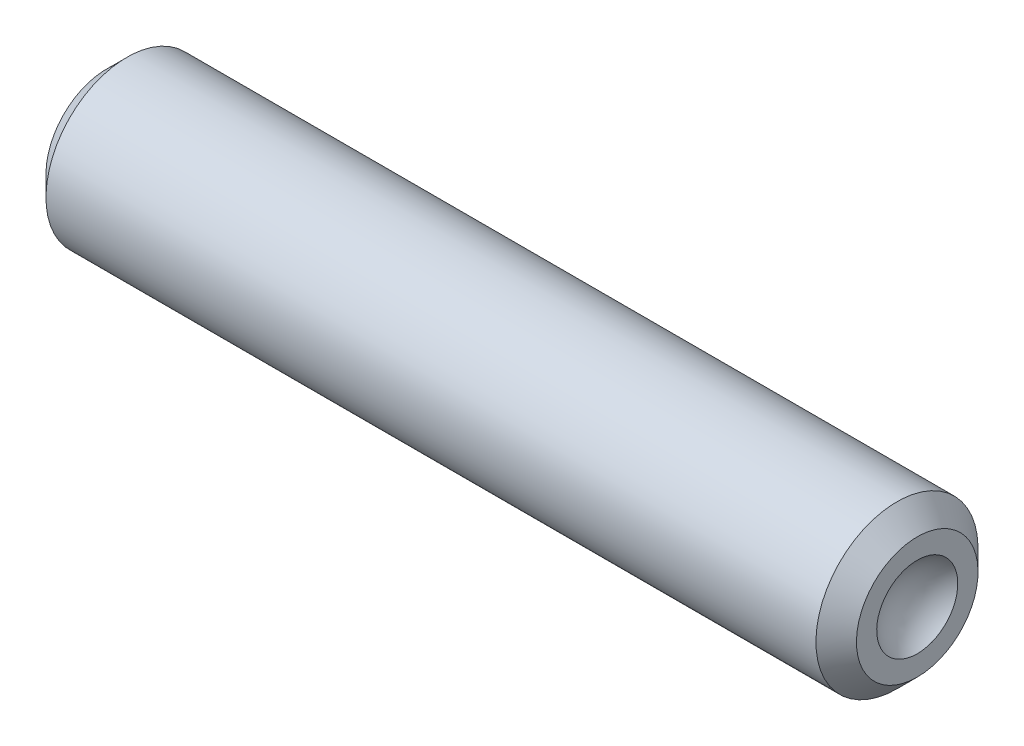
ISO-10303-21;
HEADER;
FILE_DESCRIPTION(('STEP AP214'),'2;1');
FILE_NAME('part.step','',(''),(''),'','','');
FILE_SCHEMA(('AUTOMOTIVE_DESIGN { 1 0 10303 214 1 1 1 1 }'));
ENDSEC;
DATA;
#1=APPLICATION_CONTEXT('core data for automotive mechanical design processes');
#2=APPLICATION_PROTOCOL_DEFINITION('international standard','automotive_design',2000,#1);
#3=PRODUCT_CONTEXT('',#1,'mechanical');
#4=PRODUCT('Part','Part','',(#3));
#5=PRODUCT_RELATED_PRODUCT_CATEGORY('part','',(#4));
#6=PRODUCT_DEFINITION_FORMATION('','',#4);
#7=PRODUCT_DEFINITION_CONTEXT('part definition',#1,'design');
#8=PRODUCT_DEFINITION('design','',#6,#7);
#9=PRODUCT_DEFINITION_SHAPE('','',#8);
#10=(LENGTH_UNIT() NAMED_UNIT(*) SI_UNIT(.MILLI.,.METRE.));
#11=(NAMED_UNIT(*) PLANE_ANGLE_UNIT() SI_UNIT($,.RADIAN.));
#12=(NAMED_UNIT(*) SI_UNIT($,.STERADIAN.) SOLID_ANGLE_UNIT());
#13=UNCERTAINTY_MEASURE_WITH_UNIT(LENGTH_MEASURE(1.E-05),#10,'distance_accuracy_value','');
#14=(GEOMETRIC_REPRESENTATION_CONTEXT(3) GLOBAL_UNCERTAINTY_ASSIGNED_CONTEXT((#13)) GLOBAL_UNIT_ASSIGNED_CONTEXT((#10,
#11,#12)) REPRESENTATION_CONTEXT('',''));
#15=CARTESIAN_POINT('',(0.,0.,0.));
#16=DIRECTION('',(0.,0.,1.));
#17=DIRECTION('',(1.,0.,0.));
#18=AXIS2_PLACEMENT_3D('',#15,#16,#17);
#19=CARTESIAN_POINT('',(0.,0.,0.));
#20=DIRECTION('',(1.,0.,0.));
#21=DIRECTION('',(0.,1.,0.));
#22=AXIS2_PLACEMENT_3D('',#19,#20,#21);
#23=PLANE('',#22);
#24=DIRECTION('',(0.,-0.5,-0.866025403784439));
#25=VECTOR('',#24,1.);
#26=CARTESIAN_POINT('',(0.,1.15470053837925,0.));
#27=LINE('',#26,#25);
#28=CARTESIAN_POINT('',(0.,1.15470053837925,0.));
#29=VERTEX_POINT('',#28);
#30=CARTESIAN_POINT('',(0.,0.577350269189626,-1.));
#31=VERTEX_POINT('',#30);
#32=EDGE_CURVE('E107',#29,#31,#27,.T.);
#33=ORIENTED_EDGE('',*,*,#32,.F.);
#34=DIRECTION('',(0.,0.5,-0.866025403784438));
#35=VECTOR('',#34,1.);
#36=CARTESIAN_POINT('',(0.,0.577350269189626,1.));
#37=LINE('',#36,#35);
#38=CARTESIAN_POINT('',(0.,0.577350269189626,1.));
#39=VERTEX_POINT('',#38);
#40=EDGE_CURVE('E49',#39,#29,#37,.T.);
#41=ORIENTED_EDGE('',*,*,#40,.F.);
#42=DIRECTION('',(0.,1.,0.));
#43=VECTOR('',#42,1.);
#44=CARTESIAN_POINT('',(0.,-0.577350269189626,1.));
#45=LINE('',#44,#43);
#46=CARTESIAN_POINT('',(0.,-0.577350269189626,1.));
#47=VERTEX_POINT('',#46);
#48=EDGE_CURVE('E122',#47,#39,#45,.T.);
#49=ORIENTED_EDGE('',*,*,#48,.F.);
#50=DIRECTION('',(0.,0.5,0.866025403784439));
#51=VECTOR('',#50,1.);
#52=CARTESIAN_POINT('',(0.,-1.15470053837925,0.));
#53=LINE('',#52,#51);
#54=CARTESIAN_POINT('',(0.,-1.15470053837925,0.));
#55=VERTEX_POINT('',#54);
#56=EDGE_CURVE('E116',#55,#47,#53,.T.);
#57=ORIENTED_EDGE('',*,*,#56,.F.);
#58=DIRECTION('',(0.,-0.5,0.866025403784438));
#59=VECTOR('',#58,1.);
#60=CARTESIAN_POINT('',(0.,-0.577350269189625,-1.));
#61=LINE('',#60,#59);
#62=CARTESIAN_POINT('',(0.,-0.577350269189625,-1.));
#63=VERTEX_POINT('',#62);
#64=EDGE_CURVE('E114',#63,#55,#61,.T.);
#65=ORIENTED_EDGE('',*,*,#64,.F.);
#66=DIRECTION('',(0.,-1.,0.));
#67=VECTOR('',#66,1.);
#68=CARTESIAN_POINT('',(0.,0.577350269189626,-1.));
#69=LINE('',#68,#67);
#70=EDGE_CURVE('E100',#31,#63,#69,.T.);
#71=ORIENTED_EDGE('',*,*,#70,.F.);
#72=EDGE_LOOP('',(#33,#41,#49,#57,#65,#71));
#73=FACE_BOUND('',#72,.T.);
#74=CARTESIAN_POINT('',(0.,0.,0.));
#75=DIRECTION('',(-1.,0.,0.));
#76=DIRECTION('',(0.,-1.,0.));
#77=AXIS2_PLACEMENT_3D('',#74,#75,#76);
#78=CIRCLE('',#77,1.5);
#79=CARTESIAN_POINT('',(0.,-1.5,0.));
#80=VERTEX_POINT('',#79);
#81=EDGE_CURVE('E12',#80,#80,#78,.T.);
#82=ORIENTED_EDGE('',*,*,#81,.T.);
#83=EDGE_LOOP('',(#82));
#84=FACE_BOUND('',#83,.T.);
#85=ADVANCED_FACE('F35',(#73,#84),#23,.F.);
#86=CARTESIAN_POINT('',(0.500000000000001,0.,0.));
#87=DIRECTION('',(1.,0.,0.));
#88=DIRECTION('',(0.,1.,0.));
#89=AXIS2_PLACEMENT_3D('',#86,#87,#88);
#90=CONICAL_SURFACE('',#89,2.,0.785398163397447);
#91=ORIENTED_EDGE('',*,*,#81,.F.);
#92=EDGE_LOOP('',(#91));
#93=FACE_BOUND('',#92,.T.);
#94=CARTESIAN_POINT('',(0.500000000000001,0.,0.));
#95=DIRECTION('',(-1.,0.,0.));
#96=DIRECTION('',(0.,-1.,0.));
#97=AXIS2_PLACEMENT_3D('',#94,#95,#96);
#98=CIRCLE('',#97,2.);
#99=CARTESIAN_POINT('',(0.500000000000001,-2.,0.));
#100=VERTEX_POINT('',#99);
#101=EDGE_CURVE('E42',#100,#100,#98,.T.);
#102=ORIENTED_EDGE('',*,*,#101,.T.);
#103=EDGE_LOOP('',(#102));
#104=FACE_BOUND('',#103,.T.);
#105=ADVANCED_FACE('F145',(#93,#104),#90,.T.);
#106=CARTESIAN_POINT('',(0.,0.,0.));
#107=DIRECTION('',(-1.,0.,0.));
#108=DIRECTION('',(0.,-1.,0.));
#109=AXIS2_PLACEMENT_3D('',#106,#107,#108);
#110=CYLINDRICAL_SURFACE('',#109,2.);
#111=ORIENTED_EDGE('',*,*,#101,.F.);
#112=EDGE_LOOP('',(#111));
#113=FACE_BOUND('',#112,.T.);
#114=CARTESIAN_POINT('',(19.5,0.,0.));
#115=DIRECTION('',(-1.,0.,0.));
#116=DIRECTION('',(0.,-1.,0.));
#117=AXIS2_PLACEMENT_3D('',#114,#115,#116);
#118=CIRCLE('',#117,2.);
#119=CARTESIAN_POINT('',(19.5,-2.,0.));
#120=VERTEX_POINT('',#119);
#121=EDGE_CURVE('E140',#120,#120,#118,.T.);
#122=ORIENTED_EDGE('',*,*,#121,.T.);
#123=EDGE_LOOP('',(#122));
#124=FACE_BOUND('',#123,.T.);
#125=ADVANCED_FACE('F147',(#113,#124),#110,.T.);
#126=CARTESIAN_POINT('',(20.,0.,0.));
#127=DIRECTION('',(-1.,0.,0.));
#128=DIRECTION('',(0.,-1.,0.));
#129=AXIS2_PLACEMENT_3D('',#126,#127,#128);
#130=CONICAL_SURFACE('',#129,1.5,0.785398163397449);
#131=ORIENTED_EDGE('',*,*,#121,.F.);
#132=EDGE_LOOP('',(#131));
#133=FACE_BOUND('',#132,.T.);
#134=CARTESIAN_POINT('',(20.,0.,0.));
#135=DIRECTION('',(-1.,0.,0.));
#136=DIRECTION('',(0.,-1.,0.));
#137=AXIS2_PLACEMENT_3D('',#134,#135,#136);
#138=CIRCLE('',#137,1.5);
#139=CARTESIAN_POINT('',(20.,-1.5,0.));
#140=VERTEX_POINT('',#139);
#141=EDGE_CURVE('E137',#140,#140,#138,.T.);
#142=ORIENTED_EDGE('',*,*,#141,.T.);
#143=EDGE_LOOP('',(#142));
#144=FACE_BOUND('',#143,.T.);
#145=ADVANCED_FACE('F150',(#133,#144),#130,.T.);
#146=CARTESIAN_POINT('',(20.,1.5,0.));
#147=DIRECTION('',(-1.,0.,0.));
#148=DIRECTION('',(0.,-1.,0.));
#149=AXIS2_PLACEMENT_3D('',#146,#147,#148);
#150=PLANE('',#149);
#151=ORIENTED_EDGE('',*,*,#141,.F.);
#152=EDGE_LOOP('',(#151));
#153=FACE_BOUND('',#152,.T.);
#154=CARTESIAN_POINT('',(20.,0.,0.));
#155=DIRECTION('',(-1.,0.,0.));
#156=DIRECTION('',(0.,-1.,0.));
#157=AXIS2_PLACEMENT_3D('',#154,#155,#156);
#158=CIRCLE('',#157,1.);
#159=CARTESIAN_POINT('',(20.,-1.,0.));
#160=VERTEX_POINT('',#159);
#161=EDGE_CURVE('E134',#160,#160,#158,.T.);
#162=ORIENTED_EDGE('',*,*,#161,.T.);
#163=EDGE_LOOP('',(#162));
#164=FACE_BOUND('',#163,.T.);
#165=ADVANCED_FACE('F156',(#153,#164),#150,.F.);
#166=CARTESIAN_POINT('',(20.75,0.,0.));
#167=DIRECTION('',(-1.,0.,0.));
#168=DIRECTION('',(0.,-1.,0.));
#169=AXIS2_PLACEMENT_3D('',#166,#167,#168);
#170=SPHERICAL_SURFACE('',#169,1.25);
#171=ORIENTED_EDGE('',*,*,#161,.F.);
#172=EDGE_LOOP('',(#171));
#173=FACE_BOUND('',#172,.T.);
#174=ADVANCED_FACE('F162',(#173),#170,.F.);
#175=CARTESIAN_POINT('',(23.0550504633039,0.577350269189626,1.));
#176=DIRECTION('',(0.,0.866025403784439,0.5));
#177=DIRECTION('',(0.,-0.5,0.866025403784439));
#178=AXIS2_PLACEMENT_3D('',#175,#176,#177);
#179=PLANE('',#178);
#180=DIRECTION('',(0.,-0.5,0.866025403784439));
#181=VECTOR('',#180,1.);
#182=CARTESIAN_POINT('',(18.,0.577350269189626,1.));
#183=LINE('',#182,#181);
#184=CARTESIAN_POINT('',(18.,1.15470053837925,0.));
#185=VERTEX_POINT('',#184);
#186=CARTESIAN_POINT('',(18.,0.577350269189626,1.));
#187=VERTEX_POINT('',#186);
#188=EDGE_CURVE('E68',#185,#187,#183,.T.);
#189=ORIENTED_EDGE('',*,*,#188,.T.);
#190=DIRECTION('',(-1.,0.,0.));
#191=VECTOR('',#190,1.);
#192=CARTESIAN_POINT('',(23.0550504633039,0.577350269189626,1.));
#193=LINE('',#192,#191);
#194=EDGE_CURVE('E125',#187,#39,#193,.T.);
#195=ORIENTED_EDGE('',*,*,#194,.T.);
#196=ORIENTED_EDGE('',*,*,#40,.T.);
#197=DIRECTION('',(-1.,0.,0.));
#198=VECTOR('',#197,1.);
#199=CARTESIAN_POINT('',(23.0550504633039,1.15470053837925,0.));
#200=LINE('',#199,#198);
#201=EDGE_CURVE('E104',#185,#29,#200,.T.);
#202=ORIENTED_EDGE('',*,*,#201,.F.);
#203=EDGE_LOOP('',(#189,#195,#196,#202));
#204=FACE_BOUND('',#203,.T.);
#205=ADVANCED_FACE('F167',(#204),#179,.F.);
#206=CARTESIAN_POINT('',(23.0550504633039,-0.577350269189626,1.));
#207=DIRECTION('',(0.,0.,1.));
#208=DIRECTION('',(1.,0.,0.));
#209=AXIS2_PLACEMENT_3D('',#206,#207,#208);
#210=PLANE('',#209);
#211=DIRECTION('',(0.,-1.,0.));
#212=VECTOR('',#211,1.);
#213=CARTESIAN_POINT('',(18.,-0.577350269189626,1.));
#214=LINE('',#213,#212);
#215=CARTESIAN_POINT('',(18.,-0.577350269189626,1.));
#216=VERTEX_POINT('',#215);
#217=EDGE_CURVE('E267',#187,#216,#214,.T.);
#218=ORIENTED_EDGE('',*,*,#217,.T.);
#219=DIRECTION('',(-1.,0.,0.));
#220=VECTOR('',#219,1.);
#221=CARTESIAN_POINT('',(23.0550504633039,-0.577350269189626,1.));
#222=LINE('',#221,#220);
#223=EDGE_CURVE('E127',#216,#47,#222,.T.);
#224=ORIENTED_EDGE('',*,*,#223,.T.);
#225=ORIENTED_EDGE('',*,*,#48,.T.);
#226=ORIENTED_EDGE('',*,*,#194,.F.);
#227=EDGE_LOOP('',(#218,#224,#225,#226));
#228=FACE_BOUND('',#227,.T.);
#229=ADVANCED_FACE('F172',(#228),#210,.F.);
#230=CARTESIAN_POINT('',(23.0550504633039,-1.15470053837925,0.));
#231=DIRECTION('',(0.,-0.866025403784439,0.5));
#232=DIRECTION('',(0.,-0.5,-0.866025403784439));
#233=AXIS2_PLACEMENT_3D('',#230,#231,#232);
#234=PLANE('',#233);
#235=DIRECTION('',(0.,-0.5,-0.866025403784439));
#236=VECTOR('',#235,1.);
#237=CARTESIAN_POINT('',(18.,-1.15470053837925,0.));
#238=LINE('',#237,#236);
#239=CARTESIAN_POINT('',(18.,-1.15470053837925,0.));
#240=VERTEX_POINT('',#239);
#241=EDGE_CURVE('E270',#216,#240,#238,.T.);
#242=ORIENTED_EDGE('',*,*,#241,.T.);
#243=DIRECTION('',(-1.,0.,0.));
#244=VECTOR('',#243,1.);
#245=CARTESIAN_POINT('',(23.0550504633039,-1.15470053837925,0.));
#246=LINE('',#245,#244);
#247=EDGE_CURVE('E129',#240,#55,#246,.T.);
#248=ORIENTED_EDGE('',*,*,#247,.T.);
#249=ORIENTED_EDGE('',*,*,#56,.T.);
#250=ORIENTED_EDGE('',*,*,#223,.F.);
#251=EDGE_LOOP('',(#242,#248,#249,#250));
#252=FACE_BOUND('',#251,.T.);
#253=ADVANCED_FACE('F217',(#252),#234,.F.);
#254=CARTESIAN_POINT('',(23.0550504633039,-0.577350269189626,-1.));
#255=DIRECTION('',(0.,-0.866025403784439,-0.5));
#256=DIRECTION('',(0.,0.5,-0.866025403784439));
#257=AXIS2_PLACEMENT_3D('',#254,#255,#256);
#258=PLANE('',#257);
#259=DIRECTION('',(0.,0.5,-0.866025403784439));
#260=VECTOR('',#259,1.);
#261=CARTESIAN_POINT('',(18.,-0.577350269189626,-1.));
#262=LINE('',#261,#260);
#263=CARTESIAN_POINT('',(18.,-0.577350269189626,-1.));
#264=VERTEX_POINT('',#263);
#265=EDGE_CURVE('E58',#240,#264,#262,.T.);
#266=ORIENTED_EDGE('',*,*,#265,.T.);
#267=DIRECTION('',(-1.,0.,0.));
#268=VECTOR('',#267,1.);
#269=CARTESIAN_POINT('',(23.0550504633039,-0.577350269189626,-1.));
#270=LINE('',#269,#268);
#271=EDGE_CURVE('E103',#264,#63,#270,.T.);
#272=ORIENTED_EDGE('',*,*,#271,.T.);
#273=ORIENTED_EDGE('',*,*,#64,.T.);
#274=ORIENTED_EDGE('',*,*,#247,.F.);
#275=EDGE_LOOP('',(#266,#272,#273,#274));
#276=FACE_BOUND('',#275,.T.);
#277=ADVANCED_FACE('F227',(#276),#258,.F.);
#278=CARTESIAN_POINT('',(23.0550504633039,0.577350269189626,-1.));
#279=DIRECTION('',(0.,0.,-1.));
#280=DIRECTION('',(-1.,0.,0.));
#281=AXIS2_PLACEMENT_3D('',#278,#279,#280);
#282=PLANE('',#281);
#283=DIRECTION('',(0.,1.,0.));
#284=VECTOR('',#283,1.);
#285=CARTESIAN_POINT('',(18.,0.577350269189626,-1.));
#286=LINE('',#285,#284);
#287=CARTESIAN_POINT('',(18.,0.577350269189626,-1.));
#288=VERTEX_POINT('',#287);
#289=EDGE_CURVE('E102',#264,#288,#286,.T.);
#290=ORIENTED_EDGE('',*,*,#289,.T.);
#291=DIRECTION('',(-1.,0.,0.));
#292=VECTOR('',#291,1.);
#293=CARTESIAN_POINT('',(23.0550504633039,0.577350269189626,-1.));
#294=LINE('',#293,#292);
#295=EDGE_CURVE('E95',#288,#31,#294,.T.);
#296=ORIENTED_EDGE('',*,*,#295,.T.);
#297=ORIENTED_EDGE('',*,*,#70,.T.);
#298=ORIENTED_EDGE('',*,*,#271,.F.);
#299=EDGE_LOOP('',(#290,#296,#297,#298));
#300=FACE_BOUND('',#299,.T.);
#301=ADVANCED_FACE('F97',(#300),#282,.F.);
#302=CARTESIAN_POINT('',(23.0550504633039,1.15470053837925,0.));
#303=DIRECTION('',(0.,0.866025403784439,-0.5));
#304=DIRECTION('',(0.,0.5,0.866025403784439));
#305=AXIS2_PLACEMENT_3D('',#302,#303,#304);
#306=PLANE('',#305);
#307=DIRECTION('',(0.,0.5,0.866025403784439));
#308=VECTOR('',#307,1.);
#309=CARTESIAN_POINT('',(18.,1.15470053837925,0.));
#310=LINE('',#309,#308);
#311=EDGE_CURVE('E77',#288,#185,#310,.T.);
#312=ORIENTED_EDGE('',*,*,#311,.T.);
#313=ORIENTED_EDGE('',*,*,#201,.T.);
#314=ORIENTED_EDGE('',*,*,#32,.T.);
#315=ORIENTED_EDGE('',*,*,#295,.F.);
#316=EDGE_LOOP('',(#312,#313,#314,#315));
#317=FACE_BOUND('',#316,.T.);
#318=ADVANCED_FACE('F108',(#317),#306,.F.);
#319=CARTESIAN_POINT('',(18.,1.5,0.));
#320=DIRECTION('',(-1.,0.,0.));
#321=DIRECTION('',(0.,-1.,0.));
#322=AXIS2_PLACEMENT_3D('',#319,#320,#321);
#323=PLANE('',#322);
#324=ORIENTED_EDGE('',*,*,#188,.F.);
#325=ORIENTED_EDGE('',*,*,#311,.F.);
#326=ORIENTED_EDGE('',*,*,#289,.F.);
#327=ORIENTED_EDGE('',*,*,#265,.F.);
#328=ORIENTED_EDGE('',*,*,#241,.F.);
#329=ORIENTED_EDGE('',*,*,#217,.F.);
#330=EDGE_LOOP('',(#324,#325,#326,#327,#328,#329));
#331=FACE_BOUND('',#330,.T.);
#332=ADVANCED_FACE('F253',(#331),#323,.T.);
#333=CLOSED_SHELL('',(#85,#105,#125,#145,#165,#174,#205,#229,#253,#277,#301,#318,#332));
#334=MANIFOLD_SOLID_BREP('B2',#333);
#335=ADVANCED_BREP_SHAPE_REPRESENTATION('',(#18,#334),#14);
#336=SHAPE_DEFINITION_REPRESENTATION(#9,#335);
ENDSEC;
END-ISO-10303-21;
